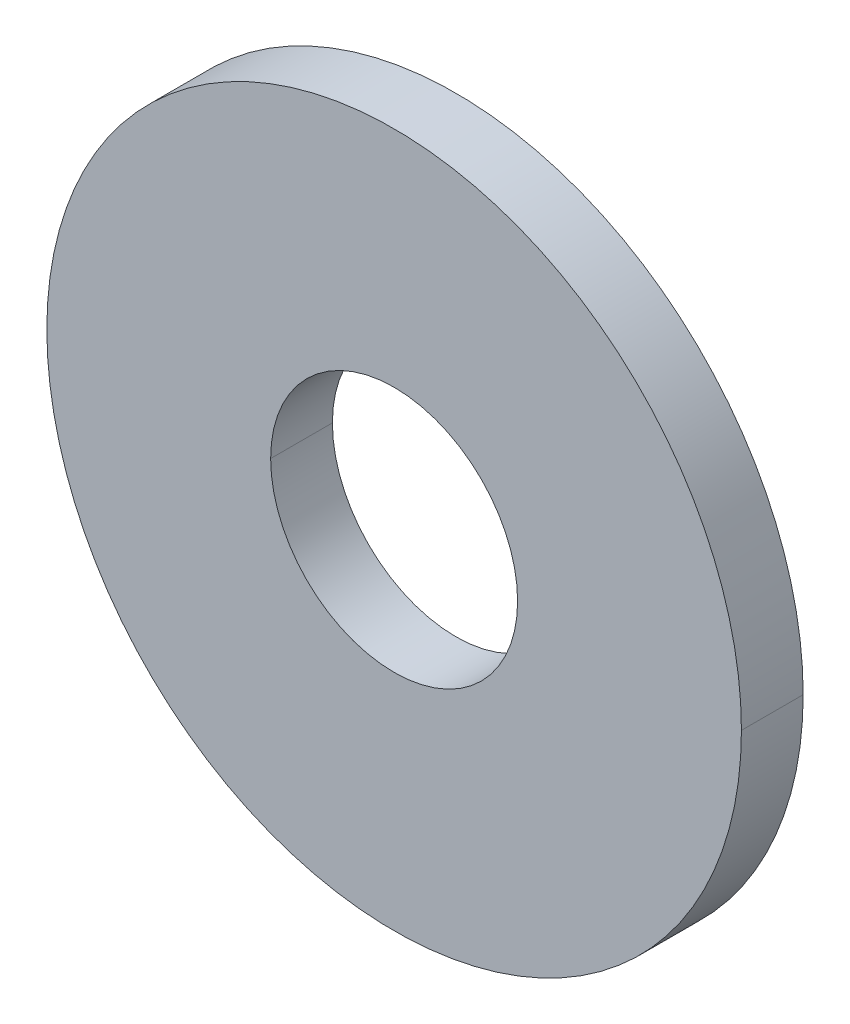
ISO-10303-21;
HEADER;
FILE_DESCRIPTION(('STEP AP214'),'2;1');
FILE_NAME('part.step','',(''),(''),'','','');
FILE_SCHEMA(('AUTOMOTIVE_DESIGN { 1 0 10303 214 1 1 1 1 }'));
ENDSEC;
DATA;
#1=APPLICATION_CONTEXT('core data for automotive mechanical design processes');
#2=APPLICATION_PROTOCOL_DEFINITION('international standard','automotive_design',2000,#1);
#3=PRODUCT_CONTEXT('',#1,'mechanical');
#4=PRODUCT('Part','Part','',(#3));
#5=PRODUCT_RELATED_PRODUCT_CATEGORY('part','',(#4));
#6=PRODUCT_DEFINITION_FORMATION('','',#4);
#7=PRODUCT_DEFINITION_CONTEXT('part definition',#1,'design');
#8=PRODUCT_DEFINITION('design','',#6,#7);
#9=PRODUCT_DEFINITION_SHAPE('','',#8);
#10=(LENGTH_UNIT() NAMED_UNIT(*) SI_UNIT(.MILLI.,.METRE.));
#11=(NAMED_UNIT(*) PLANE_ANGLE_UNIT() SI_UNIT($,.RADIAN.));
#12=(NAMED_UNIT(*) SI_UNIT($,.STERADIAN.) SOLID_ANGLE_UNIT());
#13=UNCERTAINTY_MEASURE_WITH_UNIT(LENGTH_MEASURE(1.E-05),#10,'distance_accuracy_value','');
#14=(GEOMETRIC_REPRESENTATION_CONTEXT(3) GLOBAL_UNCERTAINTY_ASSIGNED_CONTEXT((#13)) GLOBAL_UNIT_ASSIGNED_CONTEXT((#10,
#11,#12)) REPRESENTATION_CONTEXT('',''));
#15=CARTESIAN_POINT('',(0.,0.,0.));
#16=DIRECTION('',(0.,0.,1.));
#17=DIRECTION('',(1.,0.,0.));
#18=AXIS2_PLACEMENT_3D('',#15,#16,#17);
#19=CARTESIAN_POINT('',(0.,0.,0.8));
#20=DIRECTION('',(0.,0.,-1.));
#21=DIRECTION('',(-1.,0.,0.));
#22=AXIS2_PLACEMENT_3D('',#19,#20,#21);
#23=CYLINDRICAL_SURFACE('',#22,1.6);
#24=DIRECTION('',(0.,0.,-1.));
#25=VECTOR('',#24,1.);
#26=CARTESIAN_POINT('',(1.6,0.,0.8));
#27=LINE('',#26,#25);
#28=CARTESIAN_POINT('',(1.6,0.,0.8));
#29=VERTEX_POINT('',#28);
#30=CARTESIAN_POINT('',(1.6,0.,0.));
#31=VERTEX_POINT('',#30);
#32=EDGE_CURVE('E94',#29,#31,#27,.T.);
#33=ORIENTED_EDGE('',*,*,#32,.F.);
#34=CARTESIAN_POINT('',(0.,0.,0.8));
#35=DIRECTION('',(0.,0.,1.));
#36=DIRECTION('',(1.,0.,0.));
#37=AXIS2_PLACEMENT_3D('',#34,#35,#36);
#38=CIRCLE('',#37,1.6);
#39=CARTESIAN_POINT('',(-1.6,0.,0.8));
#40=VERTEX_POINT('',#39);
#41=EDGE_CURVE('E81',#29,#40,#38,.T.);
#42=ORIENTED_EDGE('',*,*,#41,.T.);
#43=DIRECTION('',(0.,0.,-1.));
#44=VECTOR('',#43,1.);
#45=CARTESIAN_POINT('',(-1.6,0.,0.8));
#46=LINE('',#45,#44);
#47=CARTESIAN_POINT('',(-1.6,0.,0.));
#48=VERTEX_POINT('',#47);
#49=EDGE_CURVE('E20',#40,#48,#46,.T.);
#50=ORIENTED_EDGE('',*,*,#49,.T.);
#51=CARTESIAN_POINT('',(0.,0.,0.));
#52=DIRECTION('',(0.,0.,1.));
#53=DIRECTION('',(1.,0.,0.));
#54=AXIS2_PLACEMENT_3D('',#51,#52,#53);
#55=CIRCLE('',#54,1.6);
#56=EDGE_CURVE('E10',#31,#48,#55,.T.);
#57=ORIENTED_EDGE('',*,*,#56,.F.);
#58=EDGE_LOOP('',(#33,#42,#50,#57));
#59=FACE_BOUND('',#58,.T.);
#60=ADVANCED_FACE('F16',(#59),#23,.F.);
#61=CARTESIAN_POINT('',(0.,0.,0.8));
#62=DIRECTION('',(0.,0.,-1.));
#63=DIRECTION('',(-1.,0.,0.));
#64=AXIS2_PLACEMENT_3D('',#61,#62,#63);
#65=CYLINDRICAL_SURFACE('',#64,4.5);
#66=DIRECTION('',(0.,0.,-1.));
#67=VECTOR('',#66,1.);
#68=CARTESIAN_POINT('',(4.5,0.,0.8));
#69=LINE('',#68,#67);
#70=CARTESIAN_POINT('',(4.5,0.,0.8));
#71=VERTEX_POINT('',#70);
#72=CARTESIAN_POINT('',(4.5,0.,0.));
#73=VERTEX_POINT('',#72);
#74=EDGE_CURVE('E106',#71,#73,#69,.T.);
#75=ORIENTED_EDGE('',*,*,#74,.F.);
#76=CARTESIAN_POINT('',(0.,0.,0.8));
#77=DIRECTION('',(0.,0.,1.));
#78=DIRECTION('',(1.,0.,0.));
#79=AXIS2_PLACEMENT_3D('',#76,#77,#78);
#80=CIRCLE('',#79,4.5);
#81=CARTESIAN_POINT('',(-4.5,0.,0.8));
#82=VERTEX_POINT('',#81);
#83=EDGE_CURVE('E59',#82,#71,#80,.T.);
#84=ORIENTED_EDGE('',*,*,#83,.F.);
#85=DIRECTION('',(0.,0.,-1.));
#86=VECTOR('',#85,1.);
#87=CARTESIAN_POINT('',(-4.5,0.,0.8));
#88=LINE('',#87,#86);
#89=CARTESIAN_POINT('',(-4.5,0.,0.));
#90=VERTEX_POINT('',#89);
#91=EDGE_CURVE('E114',#82,#90,#88,.T.);
#92=ORIENTED_EDGE('',*,*,#91,.T.);
#93=CARTESIAN_POINT('',(0.,0.,0.));
#94=DIRECTION('',(0.,0.,1.));
#95=DIRECTION('',(1.,0.,0.));
#96=AXIS2_PLACEMENT_3D('',#93,#94,#95);
#97=CIRCLE('',#96,4.5);
#98=EDGE_CURVE('E27',#90,#73,#97,.T.);
#99=ORIENTED_EDGE('',*,*,#98,.T.);
#100=EDGE_LOOP('',(#75,#84,#92,#99));
#101=FACE_BOUND('',#100,.T.);
#102=ADVANCED_FACE('F132',(#101),#65,.T.);
#103=CARTESIAN_POINT('',(0.,0.,0.));
#104=DIRECTION('',(0.,0.,1.));
#105=DIRECTION('',(1.,0.,0.));
#106=AXIS2_PLACEMENT_3D('',#103,#104,#105);
#107=PLANE('',#106);
#108=CARTESIAN_POINT('',(0.,0.,0.));
#109=DIRECTION('',(0.,0.,1.));
#110=DIRECTION('',(1.,0.,0.));
#111=AXIS2_PLACEMENT_3D('',#108,#109,#110);
#112=CIRCLE('',#111,1.6);
#113=EDGE_CURVE('E98',#48,#31,#112,.T.);
#114=ORIENTED_EDGE('',*,*,#113,.T.);
#115=ORIENTED_EDGE('',*,*,#56,.T.);
#116=EDGE_LOOP('',(#114,#115));
#117=FACE_BOUND('',#116,.T.);
#118=ORIENTED_EDGE('',*,*,#98,.F.);
#119=CARTESIAN_POINT('',(0.,0.,0.));
#120=DIRECTION('',(0.,0.,1.));
#121=DIRECTION('',(1.,0.,0.));
#122=AXIS2_PLACEMENT_3D('',#119,#120,#121);
#123=CIRCLE('',#122,4.5);
#124=EDGE_CURVE('E109',#73,#90,#123,.T.);
#125=ORIENTED_EDGE('',*,*,#124,.F.);
#126=EDGE_LOOP('',(#118,#125));
#127=FACE_BOUND('',#126,.T.);
#128=ADVANCED_FACE('F130',(#117,#127),#107,.F.);
#129=CARTESIAN_POINT('',(0.,0.,0.8));
#130=DIRECTION('',(0.,0.,1.));
#131=DIRECTION('',(1.,0.,0.));
#132=AXIS2_PLACEMENT_3D('',#129,#130,#131);
#133=PLANE('',#132);
#134=CARTESIAN_POINT('',(0.,0.,0.8));
#135=DIRECTION('',(0.,0.,1.));
#136=DIRECTION('',(1.,0.,0.));
#137=AXIS2_PLACEMENT_3D('',#134,#135,#136);
#138=CIRCLE('',#137,1.6);
#139=EDGE_CURVE('E90',#40,#29,#138,.T.);
#140=ORIENTED_EDGE('',*,*,#139,.F.);
#141=ORIENTED_EDGE('',*,*,#41,.F.);
#142=EDGE_LOOP('',(#140,#141));
#143=FACE_BOUND('',#142,.T.);
#144=ORIENTED_EDGE('',*,*,#83,.T.);
#145=CARTESIAN_POINT('',(0.,0.,0.8));
#146=DIRECTION('',(0.,0.,1.));
#147=DIRECTION('',(1.,0.,0.));
#148=AXIS2_PLACEMENT_3D('',#145,#146,#147);
#149=CIRCLE('',#148,4.5);
#150=EDGE_CURVE('E110',#71,#82,#149,.T.);
#151=ORIENTED_EDGE('',*,*,#150,.T.);
#152=EDGE_LOOP('',(#144,#151));
#153=FACE_BOUND('',#152,.T.);
#154=ADVANCED_FACE('F18',(#143,#153),#133,.T.);
#155=CARTESIAN_POINT('',(0.,0.,0.8));
#156=DIRECTION('',(0.,0.,-1.));
#157=DIRECTION('',(-1.,0.,0.));
#158=AXIS2_PLACEMENT_3D('',#155,#156,#157);
#159=CYLINDRICAL_SURFACE('',#158,4.5);
#160=ORIENTED_EDGE('',*,*,#150,.F.);
#161=ORIENTED_EDGE('',*,*,#74,.T.);
#162=ORIENTED_EDGE('',*,*,#124,.T.);
#163=ORIENTED_EDGE('',*,*,#91,.F.);
#164=EDGE_LOOP('',(#160,#161,#162,#163));
#165=FACE_BOUND('',#164,.T.);
#166=ADVANCED_FACE('F129',(#165),#159,.T.);
#167=CARTESIAN_POINT('',(0.,0.,0.8));
#168=DIRECTION('',(0.,0.,-1.));
#169=DIRECTION('',(-1.,0.,0.));
#170=AXIS2_PLACEMENT_3D('',#167,#168,#169);
#171=CYLINDRICAL_SURFACE('',#170,1.6);
#172=ORIENTED_EDGE('',*,*,#139,.T.);
#173=ORIENTED_EDGE('',*,*,#32,.T.);
#174=ORIENTED_EDGE('',*,*,#113,.F.);
#175=ORIENTED_EDGE('',*,*,#49,.F.);
#176=EDGE_LOOP('',(#172,#173,#174,#175));
#177=FACE_BOUND('',#176,.T.);
#178=ADVANCED_FACE('F100',(#177),#171,.F.);
#179=CLOSED_SHELL('',(#60,#102,#128,#154,#166,#178));
#180=MANIFOLD_SOLID_BREP('B1',#179);
#181=ADVANCED_BREP_SHAPE_REPRESENTATION('',(#18,#180),#14);
#182=SHAPE_DEFINITION_REPRESENTATION(#9,#181);
ENDSEC;
END-ISO-10303-21;
